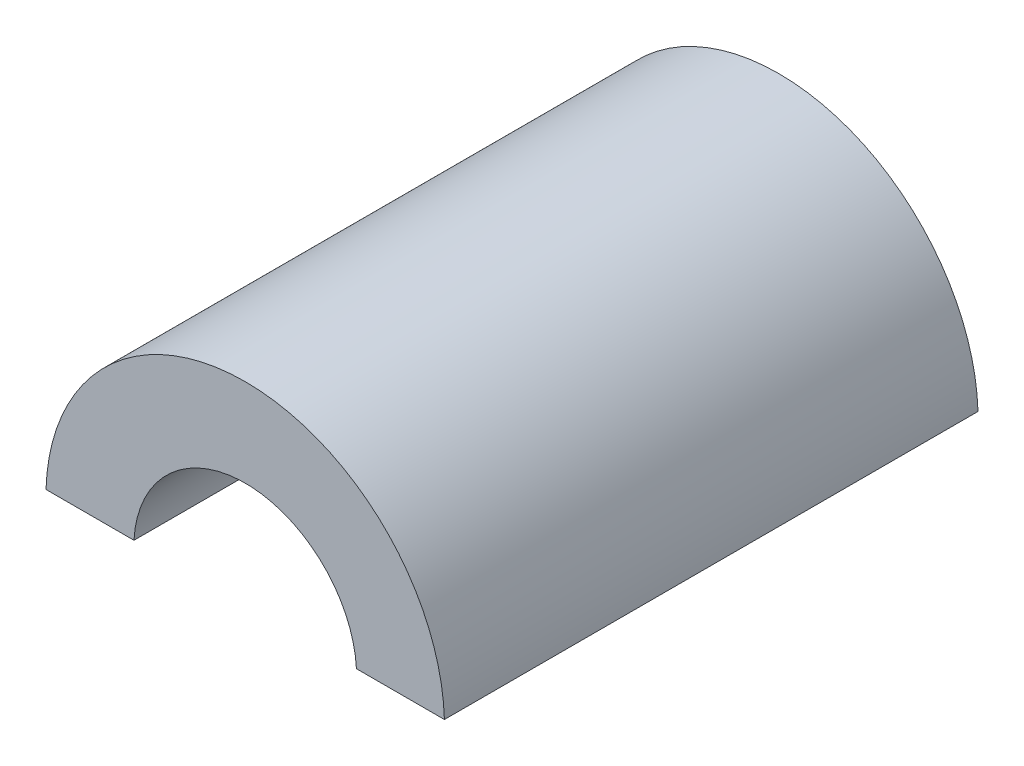
ISO-10303-21;
HEADER;
FILE_DESCRIPTION(('STEP AP214'),'2;1');
FILE_NAME('part.step','',(''),(''),'','','');
FILE_SCHEMA(('AUTOMOTIVE_DESIGN { 1 0 10303 214 1 1 1 1 }'));
ENDSEC;
DATA;
#1=APPLICATION_CONTEXT('core data for automotive mechanical design processes');
#2=APPLICATION_PROTOCOL_DEFINITION('international standard','automotive_design',2000,#1);
#3=PRODUCT_CONTEXT('',#1,'mechanical');
#4=PRODUCT('Part','Part','',(#3));
#5=PRODUCT_RELATED_PRODUCT_CATEGORY('part','',(#4));
#6=PRODUCT_DEFINITION_FORMATION('','',#4);
#7=PRODUCT_DEFINITION_CONTEXT('part definition',#1,'design');
#8=PRODUCT_DEFINITION('design','',#6,#7);
#9=PRODUCT_DEFINITION_SHAPE('','',#8);
#10=(LENGTH_UNIT() NAMED_UNIT(*) SI_UNIT(.MILLI.,.METRE.));
#11=(NAMED_UNIT(*) PLANE_ANGLE_UNIT() SI_UNIT($,.RADIAN.));
#12=(NAMED_UNIT(*) SI_UNIT($,.STERADIAN.) SOLID_ANGLE_UNIT());
#13=UNCERTAINTY_MEASURE_WITH_UNIT(LENGTH_MEASURE(1.E-05),#10,'distance_accuracy_value','');
#14=(GEOMETRIC_REPRESENTATION_CONTEXT(3) GLOBAL_UNCERTAINTY_ASSIGNED_CONTEXT((#13)) GLOBAL_UNIT_ASSIGNED_CONTEXT((#10,
#11,#12)) REPRESENTATION_CONTEXT('',''));
#15=CARTESIAN_POINT('',(0.,0.,0.));
#16=DIRECTION('',(0.,0.,1.));
#17=DIRECTION('',(1.,0.,0.));
#18=AXIS2_PLACEMENT_3D('',#15,#16,#17);
#19=CARTESIAN_POINT('',(0.,0.,85.));
#20=DIRECTION('',(0.,0.,-1.));
#21=DIRECTION('',(-1.,0.,0.));
#22=AXIS2_PLACEMENT_3D('',#19,#20,#21);
#23=CYLINDRICAL_SURFACE('',#22,31.75);
#24=CARTESIAN_POINT('',(0.,0.,0.));
#25=DIRECTION('',(0.,0.,1.));
#26=DIRECTION('',(1.,0.,0.));
#27=AXIS2_PLACEMENT_3D('',#24,#25,#26);
#28=CIRCLE('',#27,31.75);
#29=CARTESIAN_POINT('',(31.734248061046,1.,0.));
#30=VERTEX_POINT('',#29);
#31=CARTESIAN_POINT('',(-31.734248061046,1.,0.));
#32=VERTEX_POINT('',#31);
#33=EDGE_CURVE('E107',#30,#32,#28,.T.);
#34=ORIENTED_EDGE('',*,*,#33,.T.);
#35=DIRECTION('',(0.,0.,-1.));
#36=VECTOR('',#35,1.);
#37=CARTESIAN_POINT('',(-31.734248061046,1.,85.));
#38=LINE('',#37,#36);
#39=CARTESIAN_POINT('',(-31.734248061046,1.,85.));
#40=VERTEX_POINT('',#39);
#41=EDGE_CURVE('E11',#40,#32,#38,.T.);
#42=ORIENTED_EDGE('',*,*,#41,.F.);
#43=CARTESIAN_POINT('',(0.,0.,85.));
#44=DIRECTION('',(0.,0.,1.));
#45=DIRECTION('',(1.,0.,0.));
#46=AXIS2_PLACEMENT_3D('',#43,#44,#45);
#47=CIRCLE('',#46,31.75);
#48=CARTESIAN_POINT('',(31.734248061046,1.,85.));
#49=VERTEX_POINT('',#48);
#50=EDGE_CURVE('E91',#49,#40,#47,.T.);
#51=ORIENTED_EDGE('',*,*,#50,.F.);
#52=DIRECTION('',(0.,0.,-1.));
#53=VECTOR('',#52,1.);
#54=CARTESIAN_POINT('',(31.734248061046,1.,85.));
#55=LINE('',#54,#53);
#56=EDGE_CURVE('E103',#49,#30,#55,.T.);
#57=ORIENTED_EDGE('',*,*,#56,.T.);
#58=EDGE_LOOP('',(#34,#42,#51,#57));
#59=FACE_BOUND('',#58,.T.);
#60=ADVANCED_FACE('F39',(#59),#23,.T.);
#61=CARTESIAN_POINT('',(-31.734248061046,1.,85.));
#62=DIRECTION('',(0.,1.,0.));
#63=DIRECTION('',(0.,0.,1.));
#64=AXIS2_PLACEMENT_3D('',#61,#62,#63);
#65=PLANE('',#64);
#66=DIRECTION('',(1.,0.,0.));
#67=VECTOR('',#66,1.);
#68=CARTESIAN_POINT('',(-31.734248061046,1.,0.));
#69=LINE('',#68,#67);
#70=CARTESIAN_POINT('',(-17.7218085984473,0.999999999999997,0.));
#71=VERTEX_POINT('',#70);
#72=EDGE_CURVE('E96',#32,#71,#69,.T.);
#73=ORIENTED_EDGE('',*,*,#72,.T.);
#74=DIRECTION('',(0.,0.,-1.));
#75=VECTOR('',#74,1.);
#76=CARTESIAN_POINT('',(-17.7218085984473,0.999999999999997,85.));
#77=LINE('',#76,#75);
#78=CARTESIAN_POINT('',(-17.7218085984473,0.999999999999997,85.));
#79=VERTEX_POINT('',#78);
#80=EDGE_CURVE('E48',#79,#71,#77,.T.);
#81=ORIENTED_EDGE('',*,*,#80,.F.);
#82=DIRECTION('',(1.,0.,0.));
#83=VECTOR('',#82,1.);
#84=CARTESIAN_POINT('',(-31.734248061046,1.,85.));
#85=LINE('',#84,#83);
#86=EDGE_CURVE('E86',#40,#79,#85,.T.);
#87=ORIENTED_EDGE('',*,*,#86,.F.);
#88=ORIENTED_EDGE('',*,*,#41,.T.);
#89=EDGE_LOOP('',(#73,#81,#87,#88));
#90=FACE_BOUND('',#89,.T.);
#91=ADVANCED_FACE('F95',(#90),#65,.F.);
#92=CARTESIAN_POINT('',(0.,0.,85.));
#93=DIRECTION('',(0.,0.,-1.));
#94=DIRECTION('',(-1.,0.,0.));
#95=AXIS2_PLACEMENT_3D('',#92,#93,#94);
#96=CYLINDRICAL_SURFACE('',#95,17.75);
#97=CARTESIAN_POINT('',(0.,0.,0.));
#98=DIRECTION('',(0.,0.,-1.));
#99=DIRECTION('',(1.,0.,0.));
#100=AXIS2_PLACEMENT_3D('',#97,#98,#99);
#101=CIRCLE('',#100,17.75);
#102=CARTESIAN_POINT('',(17.7218085984473,1.,0.));
#103=VERTEX_POINT('',#102);
#104=EDGE_CURVE('E73',#71,#103,#101,.T.);
#105=ORIENTED_EDGE('',*,*,#104,.T.);
#106=DIRECTION('',(0.,0.,-1.));
#107=VECTOR('',#106,1.);
#108=CARTESIAN_POINT('',(17.7218085984473,1.,85.));
#109=LINE('',#108,#107);
#110=CARTESIAN_POINT('',(17.7218085984473,1.,85.));
#111=VERTEX_POINT('',#110);
#112=EDGE_CURVE('E98',#111,#103,#109,.T.);
#113=ORIENTED_EDGE('',*,*,#112,.F.);
#114=CARTESIAN_POINT('',(0.,0.,85.));
#115=DIRECTION('',(0.,0.,-1.));
#116=DIRECTION('',(1.,0.,0.));
#117=AXIS2_PLACEMENT_3D('',#114,#115,#116);
#118=CIRCLE('',#117,17.75);
#119=EDGE_CURVE('E89',#79,#111,#118,.T.);
#120=ORIENTED_EDGE('',*,*,#119,.F.);
#121=ORIENTED_EDGE('',*,*,#80,.T.);
#122=EDGE_LOOP('',(#105,#113,#120,#121));
#123=FACE_BOUND('',#122,.T.);
#124=ADVANCED_FACE('F99',(#123),#96,.F.);
#125=CARTESIAN_POINT('',(17.7218085984473,1.,85.));
#126=DIRECTION('',(0.,1.,0.));
#127=DIRECTION('',(0.,0.,1.));
#128=AXIS2_PLACEMENT_3D('',#125,#126,#127);
#129=PLANE('',#128);
#130=DIRECTION('',(1.,0.,0.));
#131=VECTOR('',#130,1.);
#132=CARTESIAN_POINT('',(17.7218085984473,1.,0.));
#133=LINE('',#132,#131);
#134=EDGE_CURVE('E79',#103,#30,#133,.T.);
#135=ORIENTED_EDGE('',*,*,#134,.T.);
#136=ORIENTED_EDGE('',*,*,#56,.F.);
#137=DIRECTION('',(1.,0.,0.));
#138=VECTOR('',#137,1.);
#139=CARTESIAN_POINT('',(17.7218085984473,1.,85.));
#140=LINE('',#139,#138);
#141=EDGE_CURVE('E56',#111,#49,#140,.T.);
#142=ORIENTED_EDGE('',*,*,#141,.F.);
#143=ORIENTED_EDGE('',*,*,#112,.T.);
#144=EDGE_LOOP('',(#135,#136,#142,#143));
#145=FACE_BOUND('',#144,.T.);
#146=ADVANCED_FACE('F120',(#145),#129,.F.);
#147=CARTESIAN_POINT('',(0.,0.,85.));
#148=DIRECTION('',(0.,0.,1.));
#149=DIRECTION('',(1.,0.,0.));
#150=AXIS2_PLACEMENT_3D('',#147,#148,#149);
#151=PLANE('',#150);
#152=ORIENTED_EDGE('',*,*,#50,.T.);
#153=ORIENTED_EDGE('',*,*,#86,.T.);
#154=ORIENTED_EDGE('',*,*,#119,.T.);
#155=ORIENTED_EDGE('',*,*,#141,.T.);
#156=EDGE_LOOP('',(#152,#153,#154,#155));
#157=FACE_BOUND('',#156,.T.);
#158=ADVANCED_FACE('F87',(#157),#151,.T.);
#159=CARTESIAN_POINT('',(0.,0.,0.));
#160=DIRECTION('',(0.,0.,1.));
#161=DIRECTION('',(1.,0.,0.));
#162=AXIS2_PLACEMENT_3D('',#159,#160,#161);
#163=PLANE('',#162);
#164=ORIENTED_EDGE('',*,*,#33,.F.);
#165=ORIENTED_EDGE('',*,*,#134,.F.);
#166=ORIENTED_EDGE('',*,*,#104,.F.);
#167=ORIENTED_EDGE('',*,*,#72,.F.);
#168=EDGE_LOOP('',(#164,#165,#166,#167));
#169=FACE_BOUND('',#168,.T.);
#170=ADVANCED_FACE('F123',(#169),#163,.F.);
#171=CLOSED_SHELL('',(#60,#91,#124,#146,#158,#170));
#172=MANIFOLD_SOLID_BREP('B2',#171);
#173=ADVANCED_BREP_SHAPE_REPRESENTATION('',(#18,#172),#14);
#174=SHAPE_DEFINITION_REPRESENTATION(#9,#173);
ENDSEC;
END-ISO-10303-21;
